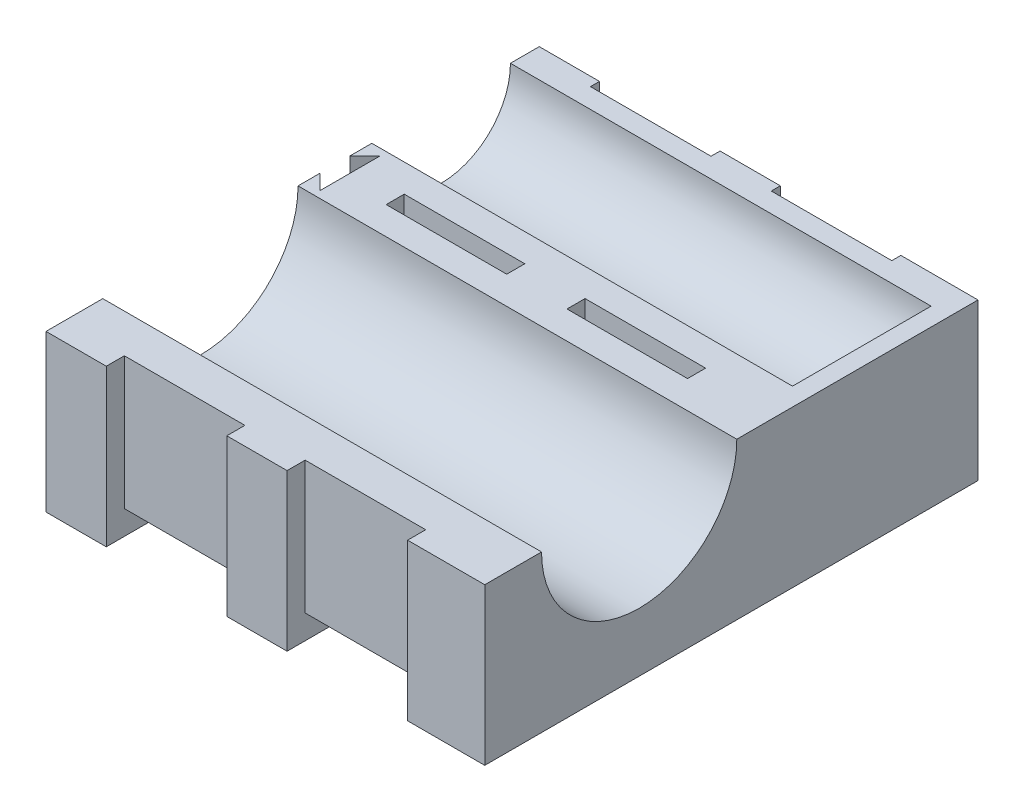
ISO-10303-21;
HEADER;
FILE_DESCRIPTION(('STEP AP214'),'2;1');
FILE_NAME('part.step','',(''),(''),'','','');
FILE_SCHEMA(('AUTOMOTIVE_DESIGN { 1 0 10303 214 1 1 1 1 }'));
ENDSEC;
DATA;
#1=APPLICATION_CONTEXT('core data for automotive mechanical design processes');
#2=APPLICATION_PROTOCOL_DEFINITION('international standard','automotive_design',2000,#1);
#3=PRODUCT_CONTEXT('',#1,'mechanical');
#4=PRODUCT('Part','Part','',(#3));
#5=PRODUCT_RELATED_PRODUCT_CATEGORY('part','',(#4));
#6=PRODUCT_DEFINITION_FORMATION('','',#4);
#7=PRODUCT_DEFINITION_CONTEXT('part definition',#1,'design');
#8=PRODUCT_DEFINITION('design','',#6,#7);
#9=PRODUCT_DEFINITION_SHAPE('','',#8);
#10=(LENGTH_UNIT() NAMED_UNIT(*) SI_UNIT(.MILLI.,.METRE.));
#11=(NAMED_UNIT(*) PLANE_ANGLE_UNIT() SI_UNIT($,.RADIAN.));
#12=(NAMED_UNIT(*) SI_UNIT($,.STERADIAN.) SOLID_ANGLE_UNIT());
#13=UNCERTAINTY_MEASURE_WITH_UNIT(LENGTH_MEASURE(1.E-05),#10,'distance_accuracy_value','');
#14=(GEOMETRIC_REPRESENTATION_CONTEXT(3) GLOBAL_UNCERTAINTY_ASSIGNED_CONTEXT((#13)) GLOBAL_UNIT_ASSIGNED_CONTEXT((#10,
#11,#12)) REPRESENTATION_CONTEXT('',''));
#15=CARTESIAN_POINT('',(0.,0.,0.));
#16=DIRECTION('',(0.,0.,1.));
#17=DIRECTION('',(1.,0.,0.));
#18=AXIS2_PLACEMENT_3D('',#15,#16,#17);
#19=CARTESIAN_POINT('',(0.,0.,0.));
#20=DIRECTION('',(1.,0.,0.));
#21=DIRECTION('',(0.,0.,-1.));
#22=AXIS2_PLACEMENT_3D('',#19,#20,#21);
#23=PLANE('',#22);
#24=DIRECTION('',(0.,0.,-1.));
#25=VECTOR('',#24,1.);
#26=CARTESIAN_POINT('',(0.,25.9607550837009,0.));
#27=LINE('',#26,#25);
#28=CARTESIAN_POINT('',(0.,25.9607550837009,-41.8200258531937));
#29=VERTEX_POINT('',#28);
#30=CARTESIAN_POINT('',(0.,25.9607550837008,-45.4412658573345));
#31=VERTEX_POINT('',#30);
#32=EDGE_CURVE('E11',#29,#31,#27,.T.);
#33=ORIENTED_EDGE('',*,*,#32,.T.);
#34=DIRECTION('',(0.,1.,0.));
#35=VECTOR('',#34,1.);
#36=CARTESIAN_POINT('',(0.,-10.3077640640441,-45.4412658573346));
#37=LINE('',#36,#35);
#38=CARTESIAN_POINT('',(0.,0.,-45.4412658573345));
#39=VERTEX_POINT('',#38);
#40=EDGE_CURVE('E292',#39,#31,#37,.T.);
#41=ORIENTED_EDGE('',*,*,#40,.F.);
#42=DIRECTION('',(0.,0.,-1.));
#43=VECTOR('',#42,1.);
#44=CARTESIAN_POINT('',(0.,0.,0.));
#45=LINE('',#44,#43);
#46=CARTESIAN_POINT('',(0.,0.,0.));
#47=VERTEX_POINT('',#46);
#48=EDGE_CURVE('E571',#47,#39,#45,.T.);
#49=ORIENTED_EDGE('',*,*,#48,.F.);
#50=DIRECTION('',(0.,1.,0.));
#51=VECTOR('',#50,1.);
#52=CARTESIAN_POINT('',(0.,0.,0.));
#53=LINE('',#52,#51);
#54=CARTESIAN_POINT('',(0.,25.9607550837009,0.));
#55=VERTEX_POINT('',#54);
#56=EDGE_CURVE('E566',#47,#55,#53,.T.);
#57=ORIENTED_EDGE('',*,*,#56,.T.);
#58=DIRECTION('',(0.,0.,-1.));
#59=VECTOR('',#58,1.);
#60=CARTESIAN_POINT('',(0.,25.9607550837009,0.));
#61=LINE('',#60,#59);
#62=CARTESIAN_POINT('',(0.,25.9607550837009,-9.4200258531937));
#63=VERTEX_POINT('',#62);
#64=EDGE_CURVE('E562',#55,#63,#61,.T.);
#65=ORIENTED_EDGE('',*,*,#64,.T.);
#66=CARTESIAN_POINT('',(0.,25.9607550837009,-25.6200258531937));
#67=DIRECTION('',(1.,0.,0.));
#68=DIRECTION('',(0.,0.,-1.));
#69=AXIS2_PLACEMENT_3D('',#66,#67,#68);
#70=CIRCLE('',#69,16.2);
#71=EDGE_CURVE('E558',#63,#29,#70,.T.);
#72=ORIENTED_EDGE('',*,*,#71,.T.);
#73=EDGE_LOOP('',(#33,#41,#49,#57,#65,#72));
#74=FACE_BOUND('',#73,.T.);
#75=ADVANCED_FACE('F40',(#74),#23,.F.);
#76=CARTESIAN_POINT('',(0.,4.,0.));
#77=DIRECTION('',(0.,-1.,0.));
#78=DIRECTION('',(0.,0.,-1.));
#79=AXIS2_PLACEMENT_3D('',#76,#77,#78);
#80=PLANE('',#79);
#81=DIRECTION('',(0.,0.,-1.));
#82=VECTOR('',#81,1.);
#83=CARTESIAN_POINT('',(10.,4.,-2.99999999999998));
#84=LINE('',#83,#82);
#85=CARTESIAN_POINT('',(10.,4.00000000000001,-49.4412658573344));
#86=VERTEX_POINT('',#85);
#87=CARTESIAN_POINT('',(10.,4.00000000000001,-80.3401409465381));
#88=VERTEX_POINT('',#87);
#89=EDGE_CURVE('E338',#86,#88,#84,.T.);
#90=ORIENTED_EDGE('',*,*,#89,.T.);
#91=DIRECTION('',(1.,0.,0.));
#92=VECTOR('',#91,1.);
#93=CARTESIAN_POINT('',(10.,4.00000000000001,-80.3401409465381));
#94=LINE('',#93,#92);
#95=CARTESIAN_POINT('',(30.,4.00000000000001,-80.3401409465381));
#96=VERTEX_POINT('',#95);
#97=EDGE_CURVE('E337',#88,#96,#94,.T.);
#98=ORIENTED_EDGE('',*,*,#97,.T.);
#99=DIRECTION('',(0.,0.,1.));
#100=VECTOR('',#99,1.);
#101=CARTESIAN_POINT('',(30.,4.,-2.99999999999996));
#102=LINE('',#101,#100);
#103=CARTESIAN_POINT('',(30.,4.00000000000001,-49.4412658573344));
#104=VERTEX_POINT('',#103);
#105=EDGE_CURVE('E342',#96,#104,#102,.T.);
#106=ORIENTED_EDGE('',*,*,#105,.T.);
#107=DIRECTION('',(1.,0.,0.));
#108=VECTOR('',#107,1.);
#109=CARTESIAN_POINT('',(10.,4.00000000000001,-49.4412658573344));
#110=LINE('',#109,#108);
#111=EDGE_CURVE('E374',#86,#104,#110,.T.);
#112=ORIENTED_EDGE('',*,*,#111,.F.);
#113=EDGE_LOOP('',(#90,#98,#106,#112));
#114=FACE_BOUND('',#113,.T.);
#115=ADVANCED_FACE('F642',(#114),#80,.T.);
#116=DIRECTION('',(1.,0.,0.));
#117=VECTOR('',#116,1.);
#118=CARTESIAN_POINT('',(10.,4.00000000000001,-46.4412658573344));
#119=LINE('',#118,#117);
#120=CARTESIAN_POINT('',(10.,4.00000000000001,-46.4412658573345));
#121=VERTEX_POINT('',#120);
#122=CARTESIAN_POINT('',(30.,4.00000000000001,-46.4412658573345));
#123=VERTEX_POINT('',#122);
#124=EDGE_CURVE('E371',#121,#123,#119,.T.);
#125=ORIENTED_EDGE('',*,*,#124,.T.);
#126=CARTESIAN_POINT('',(30.,4.,-2.99999999999996));
#127=VERTEX_POINT('',#126);
#128=EDGE_CURVE('E341',#123,#127,#102,.T.);
#129=ORIENTED_EDGE('',*,*,#128,.T.);
#130=DIRECTION('',(-1.,0.,0.));
#131=VECTOR('',#130,1.);
#132=CARTESIAN_POINT('',(10.,4.,-2.99999999999998));
#133=LINE('',#132,#131);
#134=CARTESIAN_POINT('',(10.,4.,-2.99999999999998));
#135=VERTEX_POINT('',#134);
#136=EDGE_CURVE('E345',#127,#135,#133,.T.);
#137=ORIENTED_EDGE('',*,*,#136,.T.);
#138=EDGE_CURVE('E334',#135,#121,#84,.T.);
#139=ORIENTED_EDGE('',*,*,#138,.T.);
#140=EDGE_LOOP('',(#125,#129,#137,#139));
#141=FACE_BOUND('',#140,.T.);
#142=ADVANCED_FACE('F649',(#141),#80,.T.);
#143=CARTESIAN_POINT('',(117.3,0.,0.));
#144=DIRECTION('',(0.,1.,0.));
#145=DIRECTION('',(0.,0.,1.));
#146=AXIS2_PLACEMENT_3D('',#143,#144,#145);
#147=PLANE('',#146);
#148=DIRECTION('',(-1.,0.,0.));
#149=VECTOR('',#148,1.);
#150=CARTESIAN_POINT('',(117.3,0.,0.));
#151=LINE('',#150,#149);
#152=CARTESIAN_POINT('',(40.,0.,0.));
#153=VERTEX_POINT('',#152);
#154=CARTESIAN_POINT('',(30.,0.,0.));
#155=VERTEX_POINT('',#154);
#156=EDGE_CURVE('E601',#153,#155,#151,.T.);
#157=ORIENTED_EDGE('',*,*,#156,.T.);
#158=DIRECTION('',(0.,0.,1.));
#159=VECTOR('',#158,1.);
#160=CARTESIAN_POINT('',(30.,0.,-80.3401409465381));
#161=LINE('',#160,#159);
#162=CARTESIAN_POINT('',(30.,0.,-81.8401409465381));
#163=VERTEX_POINT('',#162);
#164=EDGE_CURVE('E403',#163,#155,#161,.T.);
#165=ORIENTED_EDGE('',*,*,#164,.F.);
#166=DIRECTION('',(-1.,0.,0.));
#167=VECTOR('',#166,1.);
#168=CARTESIAN_POINT('',(117.3,0.,-81.8401409465382));
#169=LINE('',#168,#167);
#170=CARTESIAN_POINT('',(40.,0.,-81.8401409465381));
#171=VERTEX_POINT('',#170);
#172=EDGE_CURVE('E596',#171,#163,#169,.T.);
#173=ORIENTED_EDGE('',*,*,#172,.F.);
#174=DIRECTION('',(0.,0.,1.));
#175=VECTOR('',#174,1.);
#176=CARTESIAN_POINT('',(40.,0.,0.));
#177=LINE('',#176,#175);
#178=EDGE_CURVE('E432',#171,#153,#177,.T.);
#179=ORIENTED_EDGE('',*,*,#178,.T.);
#180=EDGE_LOOP('',(#157,#165,#173,#179));
#181=FACE_BOUND('',#180,.T.);
#182=ADVANCED_FACE('F704',(#181),#147,.F.);
#183=CARTESIAN_POINT('',(0.,4.,0.));
#184=DIRECTION('',(0.,-1.,0.));
#185=DIRECTION('',(0.,0.,-1.));
#186=AXIS2_PLACEMENT_3D('',#183,#184,#185);
#187=PLANE('',#186);
#188=DIRECTION('',(0.,0.,-1.));
#189=VECTOR('',#188,1.);
#190=CARTESIAN_POINT('',(40.,4.,-2.99999999999998));
#191=LINE('',#190,#189);
#192=CARTESIAN_POINT('',(40.,4.00000000000001,-49.4412658573349));
#193=VERTEX_POINT('',#192);
#194=CARTESIAN_POINT('',(40.,4.00000000000001,-80.3401409465381));
#195=VERTEX_POINT('',#194);
#196=EDGE_CURVE('E333',#193,#195,#191,.T.);
#197=ORIENTED_EDGE('',*,*,#196,.T.);
#198=DIRECTION('',(1.,0.,0.));
#199=VECTOR('',#198,1.);
#200=CARTESIAN_POINT('',(40.,4.00000000000001,-80.3401409465381));
#201=LINE('',#200,#199);
#202=CARTESIAN_POINT('',(60.,4.00000000000001,-80.3401409465381));
#203=VERTEX_POINT('',#202);
#204=EDGE_CURVE('E353',#195,#203,#201,.T.);
#205=ORIENTED_EDGE('',*,*,#204,.T.);
#206=DIRECTION('',(0.,0.,1.));
#207=VECTOR('',#206,1.);
#208=CARTESIAN_POINT('',(60.,4.,-2.99999999999996));
#209=LINE('',#208,#207);
#210=CARTESIAN_POINT('',(60.,4.00000000000001,-49.4412658573349));
#211=VERTEX_POINT('',#210);
#212=EDGE_CURVE('E358',#203,#211,#209,.T.);
#213=ORIENTED_EDGE('',*,*,#212,.T.);
#214=DIRECTION('',(1.,0.,0.));
#215=VECTOR('',#214,1.);
#216=CARTESIAN_POINT('',(40.,4.00000000000001,-49.4412658573348));
#217=LINE('',#216,#215);
#218=EDGE_CURVE('E367',#193,#211,#217,.T.);
#219=ORIENTED_EDGE('',*,*,#218,.F.);
#220=EDGE_LOOP('',(#197,#205,#213,#219));
#221=FACE_BOUND('',#220,.T.);
#222=ADVANCED_FACE('F700',(#221),#187,.T.);
#223=DIRECTION('',(1.,0.,0.));
#224=VECTOR('',#223,1.);
#225=CARTESIAN_POINT('',(40.,4.00000000000001,-46.4412658573348));
#226=LINE('',#225,#224);
#227=CARTESIAN_POINT('',(40.,4.00000000000001,-46.4412658573349));
#228=VERTEX_POINT('',#227);
#229=CARTESIAN_POINT('',(60.,4.00000000000001,-46.4412658573349));
#230=VERTEX_POINT('',#229);
#231=EDGE_CURVE('E349',#228,#230,#226,.T.);
#232=ORIENTED_EDGE('',*,*,#231,.T.);
#233=CARTESIAN_POINT('',(60.,4.,-2.99999999999996));
#234=VERTEX_POINT('',#233);
#235=EDGE_CURVE('E357',#230,#234,#209,.T.);
#236=ORIENTED_EDGE('',*,*,#235,.T.);
#237=DIRECTION('',(-1.,0.,0.));
#238=VECTOR('',#237,1.);
#239=CARTESIAN_POINT('',(40.,4.,-2.99999999999998));
#240=LINE('',#239,#238);
#241=CARTESIAN_POINT('',(40.,4.,-2.99999999999998));
#242=VERTEX_POINT('',#241);
#243=EDGE_CURVE('E361',#234,#242,#240,.T.);
#244=ORIENTED_EDGE('',*,*,#243,.T.);
#245=EDGE_CURVE('E350',#242,#228,#191,.T.);
#246=ORIENTED_EDGE('',*,*,#245,.T.);
#247=EDGE_LOOP('',(#232,#236,#244,#246));
#248=FACE_BOUND('',#247,.T.);
#249=ADVANCED_FACE('F703',(#248),#187,.T.);
#250=CARTESIAN_POINT('',(72.8,0.,-81.8401409465382));
#251=VERTEX_POINT('',#250);
#252=CARTESIAN_POINT('',(60.,0.,-81.8401409465381));
#253=VERTEX_POINT('',#252);
#254=EDGE_CURVE('E592',#251,#253,#169,.T.);
#255=ORIENTED_EDGE('',*,*,#254,.F.);
#256=DIRECTION('',(0.,0.,-1.));
#257=VECTOR('',#256,1.);
#258=CARTESIAN_POINT('',(72.8,0.,8.65324250901719));
#259=LINE('',#258,#257);
#260=CARTESIAN_POINT('',(72.8,0.,0.));
#261=VERTEX_POINT('',#260);
#262=EDGE_CURVE('E330',#261,#251,#259,.T.);
#263=ORIENTED_EDGE('',*,*,#262,.F.);
#264=CARTESIAN_POINT('',(60.,0.,0.));
#265=VERTEX_POINT('',#264);
#266=EDGE_CURVE('E597',#261,#265,#151,.T.);
#267=ORIENTED_EDGE('',*,*,#266,.T.);
#268=DIRECTION('',(0.,0.,-1.));
#269=VECTOR('',#268,1.);
#270=CARTESIAN_POINT('',(60.,0.,-2.99999999999994));
#271=LINE('',#270,#269);
#272=EDGE_CURVE('E408',#265,#253,#271,.T.);
#273=ORIENTED_EDGE('',*,*,#272,.T.);
#274=EDGE_LOOP('',(#255,#263,#267,#273));
#275=FACE_BOUND('',#274,.T.);
#276=ADVANCED_FACE('F806',(#275),#147,.F.);
#277=ORIENTED_EDGE('',*,*,#48,.T.);
#278=DIRECTION('',(-0.707106781186549,0.,-0.707106781186546));
#279=VECTOR('',#278,1.);
#280=CARTESIAN_POINT('',(0.,0.,-45.4412658573345));
#281=LINE('',#280,#279);
#282=CARTESIAN_POINT('',(2.50000000000001,0.,-42.9412658573345));
#283=VERTEX_POINT('',#282);
#284=EDGE_CURVE('E315',#283,#39,#281,.T.);
#285=ORIENTED_EDGE('',*,*,#284,.F.);
#286=DIRECTION('',(0.,0.,1.));
#287=VECTOR('',#286,1.);
#288=CARTESIAN_POINT('',(2.50000000000001,0.,-42.9412658573346));
#289=LINE('',#288,#287);
#290=CARTESIAN_POINT('',(2.5,0.,-52.9412658573345));
#291=VERTEX_POINT('',#290);
#292=EDGE_CURVE('E283',#291,#283,#289,.T.);
#293=ORIENTED_EDGE('',*,*,#292,.F.);
#294=DIRECTION('',(0.707106781186549,0.,-0.707106781186546));
#295=VECTOR('',#294,1.);
#296=CARTESIAN_POINT('',(2.50000000000001,0.,-52.9412658573345));
#297=LINE('',#296,#295);
#298=CARTESIAN_POINT('',(0.,0.,-50.4412658573345));
#299=VERTEX_POINT('',#298);
#300=EDGE_CURVE('E306',#299,#291,#297,.T.);
#301=ORIENTED_EDGE('',*,*,#300,.F.);
#302=CARTESIAN_POINT('',(0.,0.,-81.8401409465382));
#303=VERTEX_POINT('',#302);
#304=EDGE_CURVE('E570',#299,#303,#45,.T.);
#305=ORIENTED_EDGE('',*,*,#304,.T.);
#306=CARTESIAN_POINT('',(10.,0.,-81.8401409465381));
#307=VERTEX_POINT('',#306);
#308=EDGE_CURVE('E590',#307,#303,#169,.T.);
#309=ORIENTED_EDGE('',*,*,#308,.F.);
#310=DIRECTION('',(0.,0.,-1.));
#311=VECTOR('',#310,1.);
#312=CARTESIAN_POINT('',(10.,0.,-81.8401409465381));
#313=LINE('',#312,#311);
#314=CARTESIAN_POINT('',(10.,0.,0.));
#315=VERTEX_POINT('',#314);
#316=EDGE_CURVE('E442',#315,#307,#313,.T.);
#317=ORIENTED_EDGE('',*,*,#316,.F.);
#318=EDGE_CURVE('E595',#315,#47,#151,.T.);
#319=ORIENTED_EDGE('',*,*,#318,.T.);
#320=EDGE_LOOP('',(#277,#285,#293,#301,#305,#309,#317,#319));
#321=FACE_BOUND('',#320,.T.);
#322=ADVANCED_FACE('F791',(#321),#147,.F.);
#323=CARTESIAN_POINT('',(117.3,0.,0.));
#324=DIRECTION('',(0.,0.,1.));
#325=DIRECTION('',(1.,0.,0.));
#326=AXIS2_PLACEMENT_3D('',#323,#324,#325);
#327=PLANE('',#326);
#328=DIRECTION('',(0.,1.,0.));
#329=VECTOR('',#328,1.);
#330=CARTESIAN_POINT('',(72.8,-0.00100000000036876,0.));
#331=LINE('',#330,#329);
#332=CARTESIAN_POINT('',(72.8,25.9607550837007,1.05818132034585E-13));
#333=VERTEX_POINT('',#332);
#334=EDGE_CURVE('E322',#261,#333,#331,.T.);
#335=ORIENTED_EDGE('',*,*,#334,.T.);
#336=DIRECTION('',(-1.,0.,0.));
#337=VECTOR('',#336,1.);
#338=CARTESIAN_POINT('',(117.3,25.9607550837009,0.));
#339=LINE('',#338,#337);
#340=CARTESIAN_POINT('',(60.,25.9607550837009,0.));
#341=VERTEX_POINT('',#340);
#342=EDGE_CURVE('E602',#333,#341,#339,.T.);
#343=ORIENTED_EDGE('',*,*,#342,.T.);
#344=DIRECTION('',(0.,1.,0.));
#345=VECTOR('',#344,1.);
#346=CARTESIAN_POINT('',(60.,-20.2237484161567,0.));
#347=LINE('',#346,#345);
#348=EDGE_CURVE('E411',#265,#341,#347,.T.);
#349=ORIENTED_EDGE('',*,*,#348,.F.);
#350=ORIENTED_EDGE('',*,*,#266,.F.);
#351=EDGE_LOOP('',(#335,#343,#349,#350));
#352=FACE_BOUND('',#351,.T.);
#353=ADVANCED_FACE('F720',(#352),#327,.T.);
#354=CARTESIAN_POINT('',(40.,-20.2237484161567,-2.99999999999994));
#355=DIRECTION('',(0.,0.,1.));
#356=DIRECTION('',(0.,-1.,0.));
#357=AXIS2_PLACEMENT_3D('',#354,#355,#356);
#358=PLANE('',#357);
#359=DIRECTION('',(0.,1.,0.));
#360=VECTOR('',#359,1.);
#361=CARTESIAN_POINT('',(40.,-20.2237484161567,-2.99999999999994));
#362=LINE('',#361,#360);
#363=CARTESIAN_POINT('',(40.,25.9607550837009,-2.99999999999998));
#364=VERTEX_POINT('',#363);
#365=EDGE_CURVE('E404',#242,#364,#362,.T.);
#366=ORIENTED_EDGE('',*,*,#365,.F.);
#367=ORIENTED_EDGE('',*,*,#243,.F.);
#368=DIRECTION('',(0.,1.,0.));
#369=VECTOR('',#368,1.);
#370=CARTESIAN_POINT('',(60.,-20.2237484161567,-2.99999999999994));
#371=LINE('',#370,#369);
#372=CARTESIAN_POINT('',(60.,25.9607550837009,-2.99999999999998));
#373=VERTEX_POINT('',#372);
#374=EDGE_CURVE('E407',#234,#373,#371,.T.);
#375=ORIENTED_EDGE('',*,*,#374,.T.);
#376=DIRECTION('',(1.,0.,0.));
#377=VECTOR('',#376,1.);
#378=CARTESIAN_POINT('',(40.,25.9607550837009,-2.99999999999998));
#379=LINE('',#378,#377);
#380=EDGE_CURVE('E423',#364,#373,#379,.T.);
#381=ORIENTED_EDGE('',*,*,#380,.F.);
#382=EDGE_LOOP('',(#366,#367,#375,#381));
#383=FACE_BOUND('',#382,.T.);
#384=ADVANCED_FACE('F716',(#383),#358,.T.);
#385=ORIENTED_EDGE('',*,*,#156,.F.);
#386=DIRECTION('',(0.,1.,0.));
#387=VECTOR('',#386,1.);
#388=CARTESIAN_POINT('',(40.,-20.2237484161567,0.));
#389=LINE('',#388,#387);
#390=CARTESIAN_POINT('',(40.,25.9607550837009,0.));
#391=VERTEX_POINT('',#390);
#392=EDGE_CURVE('E415',#153,#391,#389,.T.);
#393=ORIENTED_EDGE('',*,*,#392,.T.);
#394=CARTESIAN_POINT('',(30.,25.9607550837009,0.));
#395=VERTEX_POINT('',#394);
#396=EDGE_CURVE('E606',#391,#395,#339,.T.);
#397=ORIENTED_EDGE('',*,*,#396,.T.);
#398=DIRECTION('',(0.,1.,0.));
#399=VECTOR('',#398,1.);
#400=CARTESIAN_POINT('',(30.,-20.2237484161567,0.));
#401=LINE('',#400,#399);
#402=EDGE_CURVE('E503',#155,#395,#401,.T.);
#403=ORIENTED_EDGE('',*,*,#402,.F.);
#404=EDGE_LOOP('',(#385,#393,#397,#403));
#405=FACE_BOUND('',#404,.T.);
#406=ADVANCED_FACE('F719',(#405),#327,.T.);
#407=CARTESIAN_POINT('',(10.,-20.2237484161567,-2.99999999999994));
#408=DIRECTION('',(0.,0.,1.));
#409=DIRECTION('',(0.,-1.,0.));
#410=AXIS2_PLACEMENT_3D('',#407,#408,#409);
#411=PLANE('',#410);
#412=DIRECTION('',(0.,1.,0.));
#413=VECTOR('',#412,1.);
#414=CARTESIAN_POINT('',(10.,-20.2237484161567,-2.99999999999994));
#415=LINE('',#414,#413);
#416=CARTESIAN_POINT('',(10.,25.9607550837009,-2.99999999999998));
#417=VERTEX_POINT('',#416);
#418=EDGE_CURVE('E431',#135,#417,#415,.T.);
#419=ORIENTED_EDGE('',*,*,#418,.F.);
#420=ORIENTED_EDGE('',*,*,#136,.F.);
#421=DIRECTION('',(0.,1.,0.));
#422=VECTOR('',#421,1.);
#423=CARTESIAN_POINT('',(30.,-20.2237484161567,-2.99999999999994));
#424=LINE('',#423,#422);
#425=CARTESIAN_POINT('',(30.,25.9607550837009,-2.99999999999998));
#426=VERTEX_POINT('',#425);
#427=EDGE_CURVE('E500',#127,#426,#424,.T.);
#428=ORIENTED_EDGE('',*,*,#427,.T.);
#429=DIRECTION('',(1.,0.,0.));
#430=VECTOR('',#429,1.);
#431=CARTESIAN_POINT('',(10.,25.9607550837009,-2.99999999999998));
#432=LINE('',#431,#430);
#433=EDGE_CURVE('E514',#417,#426,#432,.T.);
#434=ORIENTED_EDGE('',*,*,#433,.F.);
#435=EDGE_LOOP('',(#419,#420,#428,#434));
#436=FACE_BOUND('',#435,.T.);
#437=ADVANCED_FACE('F748',(#436),#411,.T.);
#438=ORIENTED_EDGE('',*,*,#318,.F.);
#439=DIRECTION('',(0.,1.,0.));
#440=VECTOR('',#439,1.);
#441=CARTESIAN_POINT('',(10.,-20.2237484161567,0.));
#442=LINE('',#441,#440);
#443=CARTESIAN_POINT('',(10.,25.9607550837009,0.));
#444=VERTEX_POINT('',#443);
#445=EDGE_CURVE('E506',#315,#444,#442,.T.);
#446=ORIENTED_EDGE('',*,*,#445,.T.);
#447=EDGE_CURVE('E600',#444,#55,#339,.T.);
#448=ORIENTED_EDGE('',*,*,#447,.T.);
#449=ORIENTED_EDGE('',*,*,#56,.F.);
#450=EDGE_LOOP('',(#438,#446,#448,#449));
#451=FACE_BOUND('',#450,.T.);
#452=ADVANCED_FACE('F751',(#451),#327,.T.);
#453=CARTESIAN_POINT('',(117.3,25.9607550837009,0.));
#454=DIRECTION('',(0.,1.,0.));
#455=DIRECTION('',(0.,0.,1.));
#456=AXIS2_PLACEMENT_3D('',#453,#454,#455);
#457=PLANE('',#456);
#458=DIRECTION('',(0.,0.,1.));
#459=VECTOR('',#458,1.);
#460=CARTESIAN_POINT('',(72.8,25.9607550837007,8.65324250901729));
#461=LINE('',#460,#459);
#462=CARTESIAN_POINT('',(72.8,25.9607550837007,-9.4200258531937));
#463=VERTEX_POINT('',#462);
#464=EDGE_CURVE('E326',#463,#333,#461,.T.);
#465=ORIENTED_EDGE('',*,*,#464,.F.);
#466=DIRECTION('',(-1.,0.,0.));
#467=VECTOR('',#466,1.);
#468=CARTESIAN_POINT('',(117.3,25.9607550837009,-9.4200258531937));
#469=LINE('',#468,#467);
#470=EDGE_CURVE('E605',#463,#63,#469,.T.);
#471=ORIENTED_EDGE('',*,*,#470,.T.);
#472=ORIENTED_EDGE('',*,*,#64,.F.);
#473=ORIENTED_EDGE('',*,*,#447,.F.);
#474=DIRECTION('',(0.,0.,-1.));
#475=VECTOR('',#474,1.);
#476=CARTESIAN_POINT('',(10.,25.9607550837009,0.));
#477=LINE('',#476,#475);
#478=EDGE_CURVE('E481',#444,#417,#477,.T.);
#479=ORIENTED_EDGE('',*,*,#478,.T.);
#480=ORIENTED_EDGE('',*,*,#433,.T.);
#481=DIRECTION('',(0.,0.,1.));
#482=VECTOR('',#481,1.);
#483=CARTESIAN_POINT('',(30.,25.9607550837009,-2.99999999999998));
#484=LINE('',#483,#482);
#485=EDGE_CURVE('E510',#426,#395,#484,.T.);
#486=ORIENTED_EDGE('',*,*,#485,.T.);
#487=ORIENTED_EDGE('',*,*,#396,.F.);
#488=DIRECTION('',(0.,0.,-1.));
#489=VECTOR('',#488,1.);
#490=CARTESIAN_POINT('',(40.,25.9607550837009,0.));
#491=LINE('',#490,#489);
#492=EDGE_CURVE('E427',#391,#364,#491,.T.);
#493=ORIENTED_EDGE('',*,*,#492,.T.);
#494=ORIENTED_EDGE('',*,*,#380,.T.);
#495=DIRECTION('',(0.,0.,1.));
#496=VECTOR('',#495,1.);
#497=CARTESIAN_POINT('',(60.,25.9607550837009,-2.99999999999998));
#498=LINE('',#497,#496);
#499=EDGE_CURVE('E419',#373,#341,#498,.T.);
#500=ORIENTED_EDGE('',*,*,#499,.T.);
#501=ORIENTED_EDGE('',*,*,#342,.F.);
#502=EDGE_LOOP('',(#465,#471,#472,#473,#479,#480,#486,#487,#493,#494,#500,#501));
#503=FACE_BOUND('',#502,.T.);
#504=ADVANCED_FACE('F757',(#503),#457,.T.);
#505=CARTESIAN_POINT('',(10.,-20.2237484161567,-46.4412658573344));
#506=DIRECTION('',(0.,0.,1.));
#507=DIRECTION('',(1.,0.,0.));
#508=AXIS2_PLACEMENT_3D('',#505,#506,#507);
#509=PLANE('',#508);
#510=ORIENTED_EDGE('',*,*,#124,.F.);
#511=DIRECTION('',(0.,1.,0.));
#512=VECTOR('',#511,1.);
#513=CARTESIAN_POINT('',(10.,-20.2237484161567,-46.4412658573344));
#514=LINE('',#513,#512);
#515=CARTESIAN_POINT('',(10.,25.9607550837008,-46.4412658573345));
#516=VERTEX_POINT('',#515);
#517=EDGE_CURVE('E537',#121,#516,#514,.T.);
#518=ORIENTED_EDGE('',*,*,#517,.T.);
#519=DIRECTION('',(1.,0.,0.));
#520=VECTOR('',#519,1.);
#521=CARTESIAN_POINT('',(10.,25.9607550837008,-46.4412658573345));
#522=LINE('',#521,#520);
#523=CARTESIAN_POINT('',(30.,25.9607550837008,-46.4412658573345));
#524=VERTEX_POINT('',#523);
#525=EDGE_CURVE('E497',#516,#524,#522,.T.);
#526=ORIENTED_EDGE('',*,*,#525,.T.);
#527=DIRECTION('',(0.,1.,0.));
#528=VECTOR('',#527,1.);
#529=CARTESIAN_POINT('',(30.,-20.2237484161567,-46.4412658573344));
#530=LINE('',#529,#528);
#531=EDGE_CURVE('E536',#123,#524,#530,.T.);
#532=ORIENTED_EDGE('',*,*,#531,.F.);
#533=EDGE_LOOP('',(#510,#518,#526,#532));
#534=FACE_BOUND('',#533,.T.);
#535=ADVANCED_FACE('F754',(#534),#509,.F.);
#536=CARTESIAN_POINT('',(10.,-20.2237484161567,-49.4412658573344));
#537=DIRECTION('',(0.,0.,1.));
#538=DIRECTION('',(1.,0.,0.));
#539=AXIS2_PLACEMENT_3D('',#536,#537,#538);
#540=PLANE('',#539);
#541=DIRECTION('',(0.,1.,0.));
#542=VECTOR('',#541,1.);
#543=CARTESIAN_POINT('',(10.,-20.2237484161567,-49.4412658573344));
#544=LINE('',#543,#542);
#545=CARTESIAN_POINT('',(10.,25.9607550837008,-49.4412658573344));
#546=VERTEX_POINT('',#545);
#547=EDGE_CURVE('E541',#86,#546,#544,.T.);
#548=ORIENTED_EDGE('',*,*,#547,.F.);
#549=ORIENTED_EDGE('',*,*,#111,.T.);
#550=DIRECTION('',(0.,1.,0.));
#551=VECTOR('',#550,1.);
#552=CARTESIAN_POINT('',(30.,-20.2237484161567,-49.4412658573344));
#553=LINE('',#552,#551);
#554=CARTESIAN_POINT('',(30.,25.9607550837008,-49.4412658573345));
#555=VERTEX_POINT('',#554);
#556=EDGE_CURVE('E544',#104,#555,#553,.T.);
#557=ORIENTED_EDGE('',*,*,#556,.T.);
#558=DIRECTION('',(1.,0.,0.));
#559=VECTOR('',#558,1.);
#560=CARTESIAN_POINT('',(10.,25.9607550837008,-49.4412658573344));
#561=LINE('',#560,#559);
#562=EDGE_CURVE('E528',#546,#555,#561,.T.);
#563=ORIENTED_EDGE('',*,*,#562,.F.);
#564=EDGE_LOOP('',(#548,#549,#557,#563));
#565=FACE_BOUND('',#564,.T.);
#566=ADVANCED_FACE('F742',(#565),#540,.T.);
#567=CARTESIAN_POINT('',(40.,-20.2237484161567,-46.4412658573348));
#568=DIRECTION('',(0.,0.,1.));
#569=DIRECTION('',(1.,0.,0.));
#570=AXIS2_PLACEMENT_3D('',#567,#568,#569);
#571=PLANE('',#570);
#572=ORIENTED_EDGE('',*,*,#231,.F.);
#573=DIRECTION('',(0.,1.,0.));
#574=VECTOR('',#573,1.);
#575=CARTESIAN_POINT('',(40.,-20.2237484161567,-46.4412658573348));
#576=LINE('',#575,#574);
#577=CARTESIAN_POINT('',(40.,25.9607550837008,-46.4412658573349));
#578=VERTEX_POINT('',#577);
#579=EDGE_CURVE('E468',#228,#578,#576,.T.);
#580=ORIENTED_EDGE('',*,*,#579,.T.);
#581=DIRECTION('',(1.,0.,0.));
#582=VECTOR('',#581,1.);
#583=CARTESIAN_POINT('',(40.,25.9607550837008,-46.4412658573349));
#584=LINE('',#583,#582);
#585=CARTESIAN_POINT('',(60.,25.9607550837008,-46.4412658573349));
#586=VERTEX_POINT('',#585);
#587=EDGE_CURVE('E489',#578,#586,#584,.T.);
#588=ORIENTED_EDGE('',*,*,#587,.T.);
#589=DIRECTION('',(0.,1.,0.));
#590=VECTOR('',#589,1.);
#591=CARTESIAN_POINT('',(60.,-20.2237484161567,-46.4412658573349));
#592=LINE('',#591,#590);
#593=EDGE_CURVE('E472',#230,#586,#592,.T.);
#594=ORIENTED_EDGE('',*,*,#593,.F.);
#595=EDGE_LOOP('',(#572,#580,#588,#594));
#596=FACE_BOUND('',#595,.T.);
#597=ADVANCED_FACE('F738',(#596),#571,.F.);
#598=CARTESIAN_POINT('',(40.,-20.2237484161567,-49.4412658573348));
#599=DIRECTION('',(0.,0.,1.));
#600=DIRECTION('',(1.,0.,0.));
#601=AXIS2_PLACEMENT_3D('',#598,#599,#600);
#602=PLANE('',#601);
#603=DIRECTION('',(0.,1.,0.));
#604=VECTOR('',#603,1.);
#605=CARTESIAN_POINT('',(40.,-20.2237484161567,-49.4412658573348));
#606=LINE('',#605,#604);
#607=CARTESIAN_POINT('',(40.,25.9607550837008,-49.4412658573349));
#608=VERTEX_POINT('',#607);
#609=EDGE_CURVE('E478',#193,#608,#606,.T.);
#610=ORIENTED_EDGE('',*,*,#609,.F.);
#611=ORIENTED_EDGE('',*,*,#218,.T.);
#612=DIRECTION('',(0.,1.,0.));
#613=VECTOR('',#612,1.);
#614=CARTESIAN_POINT('',(60.,-20.2237484161567,-49.4412658573349));
#615=LINE('',#614,#613);
#616=CARTESIAN_POINT('',(60.,25.9607550837008,-49.4412658573349));
#617=VERTEX_POINT('',#616);
#618=EDGE_CURVE('E475',#211,#617,#615,.T.);
#619=ORIENTED_EDGE('',*,*,#618,.T.);
#620=DIRECTION('',(1.,0.,0.));
#621=VECTOR('',#620,1.);
#622=CARTESIAN_POINT('',(40.,25.9607550837008,-49.4412658573349));
#623=LINE('',#622,#621);
#624=EDGE_CURVE('E471',#608,#617,#623,.T.);
#625=ORIENTED_EDGE('',*,*,#624,.F.);
#626=EDGE_LOOP('',(#610,#611,#619,#625));
#627=FACE_BOUND('',#626,.T.);
#628=ADVANCED_FACE('F741',(#627),#602,.T.);
#629=CARTESIAN_POINT('',(117.3,25.9607550837009,-25.6200258531937));
#630=DIRECTION('',(-1.,0.,0.));
#631=DIRECTION('',(0.,0.,1.));
#632=AXIS2_PLACEMENT_3D('',#629,#630,#631);
#633=CYLINDRICAL_SURFACE('',#632,16.2);
#634=CARTESIAN_POINT('',(72.8,25.9607550837009,-25.6200258531937));
#635=DIRECTION('',(-1.,0.,0.));
#636=DIRECTION('',(0.,0.,1.));
#637=AXIS2_PLACEMENT_3D('',#634,#635,#636);
#638=CIRCLE('',#637,16.2);
#639=CARTESIAN_POINT('',(72.8,25.9607550837009,-41.8200258531937));
#640=VERTEX_POINT('',#639);
#641=EDGE_CURVE('E314',#463,#640,#638,.F.);
#642=ORIENTED_EDGE('',*,*,#641,.T.);
#643=DIRECTION('',(-1.,0.,0.));
#644=VECTOR('',#643,1.);
#645=CARTESIAN_POINT('',(117.3,25.9607550837009,-41.8200258531937));
#646=LINE('',#645,#644);
#647=EDGE_CURVE('E608',#640,#29,#646,.T.);
#648=ORIENTED_EDGE('',*,*,#647,.T.);
#649=ORIENTED_EDGE('',*,*,#71,.F.);
#650=ORIENTED_EDGE('',*,*,#470,.F.);
#651=EDGE_LOOP('',(#642,#648,#649,#650));
#652=FACE_BOUND('',#651,.T.);
#653=ADVANCED_FACE('F746',(#652),#633,.F.);
#654=CARTESIAN_POINT('',(117.3,0.,-81.8401409465382));
#655=DIRECTION('',(0.,0.,1.));
#656=DIRECTION('',(0.,-1.,0.));
#657=AXIS2_PLACEMENT_3D('',#654,#655,#656);
#658=PLANE('',#657);
#659=DIRECTION('',(-1.,0.,0.));
#660=VECTOR('',#659,1.);
#661=CARTESIAN_POINT('',(117.3,25.9607550837009,-81.8401409465382));
#662=LINE('',#661,#660);
#663=CARTESIAN_POINT('',(10.,25.9607550837008,-81.8401409465381));
#664=VERTEX_POINT('',#663);
#665=CARTESIAN_POINT('',(0.,25.9607550837009,-81.8401409465382));
#666=VERTEX_POINT('',#665);
#667=EDGE_CURVE('E586',#664,#666,#662,.T.);
#668=ORIENTED_EDGE('',*,*,#667,.F.);
#669=DIRECTION('',(0.,1.,0.));
#670=VECTOR('',#669,1.);
#671=CARTESIAN_POINT('',(10.,-20.2237484161568,-81.8401409465381));
#672=LINE('',#671,#670);
#673=EDGE_CURVE('E451',#307,#664,#672,.T.);
#674=ORIENTED_EDGE('',*,*,#673,.F.);
#675=ORIENTED_EDGE('',*,*,#308,.T.);
#676=DIRECTION('',(0.,1.,0.));
#677=VECTOR('',#676,1.);
#678=CARTESIAN_POINT('',(0.,0.,-81.8401409465382));
#679=LINE('',#678,#677);
#680=EDGE_CURVE('E575',#303,#666,#679,.T.);
#681=ORIENTED_EDGE('',*,*,#680,.T.);
#682=EDGE_LOOP('',(#668,#674,#675,#681));
#683=FACE_BOUND('',#682,.T.);
#684=ADVANCED_FACE('F736',(#683),#658,.F.);
#685=CARTESIAN_POINT('',(10.,-20.2237484161568,-81.8401409465381));
#686=DIRECTION('',(-1.,0.,0.));
#687=DIRECTION('',(0.,0.,1.));
#688=AXIS2_PLACEMENT_3D('',#685,#686,#687);
#689=PLANE('',#688);
#690=ORIENTED_EDGE('',*,*,#316,.T.);
#691=ORIENTED_EDGE('',*,*,#673,.T.);
#692=DIRECTION('',(0.,0.,1.));
#693=VECTOR('',#692,1.);
#694=CARTESIAN_POINT('',(10.,25.9607550837008,-81.8401409465381));
#695=LINE('',#694,#693);
#696=CARTESIAN_POINT('',(10.,25.9607550837008,-80.3401409465381));
#697=VERTEX_POINT('',#696);
#698=EDGE_CURVE('E446',#664,#697,#695,.T.);
#699=ORIENTED_EDGE('',*,*,#698,.T.);
#700=DIRECTION('',(0.,1.,0.));
#701=VECTOR('',#700,1.);
#702=CARTESIAN_POINT('',(10.,-20.2237484161568,-80.3401409465381));
#703=LINE('',#702,#701);
#704=EDGE_CURVE('E454',#88,#697,#703,.T.);
#705=ORIENTED_EDGE('',*,*,#704,.F.);
#706=ORIENTED_EDGE('',*,*,#89,.F.);
#707=ORIENTED_EDGE('',*,*,#547,.T.);
#708=DIRECTION('',(0.,0.,1.));
#709=VECTOR('',#708,1.);
#710=CARTESIAN_POINT('',(10.,25.9607550837008,-49.4412658573344));
#711=LINE('',#710,#709);
#712=EDGE_CURVE('E532',#546,#516,#711,.T.);
#713=ORIENTED_EDGE('',*,*,#712,.T.);
#714=ORIENTED_EDGE('',*,*,#517,.F.);
#715=ORIENTED_EDGE('',*,*,#138,.F.);
#716=ORIENTED_EDGE('',*,*,#418,.T.);
#717=ORIENTED_EDGE('',*,*,#478,.F.);
#718=ORIENTED_EDGE('',*,*,#445,.F.);
#719=EDGE_LOOP('',(#690,#691,#699,#705,#706,#707,#713,#714,#715,#716,#717,#718));
#720=FACE_BOUND('',#719,.T.);
#721=ADVANCED_FACE('F729',(#720),#689,.F.);
#722=CARTESIAN_POINT('',(10.,-20.2237484161568,-80.3401409465381));
#723=DIRECTION('',(0.,0.,1.));
#724=DIRECTION('',(0.,-1.,0.));
#725=AXIS2_PLACEMENT_3D('',#722,#723,#724);
#726=PLANE('',#725);
#727=ORIENTED_EDGE('',*,*,#97,.F.);
#728=ORIENTED_EDGE('',*,*,#704,.T.);
#729=DIRECTION('',(1.,0.,0.));
#730=VECTOR('',#729,1.);
#731=CARTESIAN_POINT('',(10.,25.9607550837008,-80.3401409465381));
#732=LINE('',#731,#730);
#733=CARTESIAN_POINT('',(30.,25.9607550837009,-80.3401409465381));
#734=VERTEX_POINT('',#733);
#735=EDGE_CURVE('E436',#697,#734,#732,.T.);
#736=ORIENTED_EDGE('',*,*,#735,.T.);
#737=DIRECTION('',(0.,1.,0.));
#738=VECTOR('',#737,1.);
#739=CARTESIAN_POINT('',(30.,-20.2237484161568,-80.3401409465381));
#740=LINE('',#739,#738);
#741=EDGE_CURVE('E443',#96,#734,#740,.T.);
#742=ORIENTED_EDGE('',*,*,#741,.F.);
#743=EDGE_LOOP('',(#727,#728,#736,#742));
#744=FACE_BOUND('',#743,.T.);
#745=ADVANCED_FACE('F725',(#744),#726,.F.);
#746=CARTESIAN_POINT('',(30.,-20.2237484161568,-80.3401409465381));
#747=DIRECTION('',(1.,0.,0.));
#748=DIRECTION('',(0.,0.,-1.));
#749=AXIS2_PLACEMENT_3D('',#746,#747,#748);
#750=PLANE('',#749);
#751=ORIENTED_EDGE('',*,*,#164,.T.);
#752=ORIENTED_EDGE('',*,*,#402,.T.);
#753=ORIENTED_EDGE('',*,*,#485,.F.);
#754=ORIENTED_EDGE('',*,*,#427,.F.);
#755=ORIENTED_EDGE('',*,*,#128,.F.);
#756=ORIENTED_EDGE('',*,*,#531,.T.);
#757=DIRECTION('',(0.,0.,1.));
#758=VECTOR('',#757,1.);
#759=CARTESIAN_POINT('',(30.,25.9607550837008,-49.4412658573345));
#760=LINE('',#759,#758);
#761=EDGE_CURVE('E524',#555,#524,#760,.T.);
#762=ORIENTED_EDGE('',*,*,#761,.F.);
#763=ORIENTED_EDGE('',*,*,#556,.F.);
#764=ORIENTED_EDGE('',*,*,#105,.F.);
#765=ORIENTED_EDGE('',*,*,#741,.T.);
#766=DIRECTION('',(0.,0.,-1.));
#767=VECTOR('',#766,1.);
#768=CARTESIAN_POINT('',(30.,25.9607550837008,-80.3401409465381));
#769=LINE('',#768,#767);
#770=CARTESIAN_POINT('',(30.,25.9607550837008,-81.8401409465381));
#771=VERTEX_POINT('',#770);
#772=EDGE_CURVE('E460',#734,#771,#769,.T.);
#773=ORIENTED_EDGE('',*,*,#772,.T.);
#774=DIRECTION('',(0.,1.,0.));
#775=VECTOR('',#774,1.);
#776=CARTESIAN_POINT('',(30.,-20.2237484161568,-81.8401409465381));
#777=LINE('',#776,#775);
#778=EDGE_CURVE('E447',#163,#771,#777,.T.);
#779=ORIENTED_EDGE('',*,*,#778,.F.);
#780=EDGE_LOOP('',(#751,#752,#753,#754,#755,#756,#762,#763,#764,#765,#773,#779));
#781=FACE_BOUND('',#780,.T.);
#782=ADVANCED_FACE('F728',(#781),#750,.F.);
#783=ORIENTED_EDGE('',*,*,#172,.T.);
#784=ORIENTED_EDGE('',*,*,#778,.T.);
#785=CARTESIAN_POINT('',(40.,25.9607550837009,-81.8401409465382));
#786=VERTEX_POINT('',#785);
#787=EDGE_CURVE('E591',#786,#771,#662,.T.);
#788=ORIENTED_EDGE('',*,*,#787,.F.);
#789=DIRECTION('',(0.,1.,0.));
#790=VECTOR('',#789,1.);
#791=CARTESIAN_POINT('',(40.,-20.2237484161568,-81.8401409465381));
#792=LINE('',#791,#790);
#793=EDGE_CURVE('E384',#171,#786,#792,.T.);
#794=ORIENTED_EDGE('',*,*,#793,.F.);
#795=EDGE_LOOP('',(#783,#784,#788,#794));
#796=FACE_BOUND('',#795,.T.);
#797=ADVANCED_FACE('F714',(#796),#658,.F.);
#798=CARTESIAN_POINT('',(40.,-20.2237484161567,0.));
#799=DIRECTION('',(1.,0.,0.));
#800=DIRECTION('',(0.,0.,-1.));
#801=AXIS2_PLACEMENT_3D('',#798,#799,#800);
#802=PLANE('',#801);
#803=ORIENTED_EDGE('',*,*,#178,.F.);
#804=ORIENTED_EDGE('',*,*,#793,.T.);
#805=DIRECTION('',(0.,0.,1.));
#806=VECTOR('',#805,1.);
#807=CARTESIAN_POINT('',(40.,25.9607550837008,-81.8401409465381));
#808=LINE('',#807,#806);
#809=CARTESIAN_POINT('',(40.,25.9607550837008,-80.3401409465381));
#810=VERTEX_POINT('',#809);
#811=EDGE_CURVE('E395',#786,#810,#808,.T.);
#812=ORIENTED_EDGE('',*,*,#811,.T.);
#813=DIRECTION('',(0.,1.,0.));
#814=VECTOR('',#813,1.);
#815=CARTESIAN_POINT('',(40.,-20.2237484161568,-80.3401409465381));
#816=LINE('',#815,#814);
#817=EDGE_CURVE('E387',#195,#810,#816,.T.);
#818=ORIENTED_EDGE('',*,*,#817,.F.);
#819=ORIENTED_EDGE('',*,*,#196,.F.);
#820=ORIENTED_EDGE('',*,*,#609,.T.);
#821=DIRECTION('',(0.,0.,1.));
#822=VECTOR('',#821,1.);
#823=CARTESIAN_POINT('',(40.,25.9607550837008,-49.4412658573349));
#824=LINE('',#823,#822);
#825=EDGE_CURVE('E493',#608,#578,#824,.T.);
#826=ORIENTED_EDGE('',*,*,#825,.T.);
#827=ORIENTED_EDGE('',*,*,#579,.F.);
#828=ORIENTED_EDGE('',*,*,#245,.F.);
#829=ORIENTED_EDGE('',*,*,#365,.T.);
#830=ORIENTED_EDGE('',*,*,#492,.F.);
#831=ORIENTED_EDGE('',*,*,#392,.F.);
#832=EDGE_LOOP('',(#803,#804,#812,#818,#819,#820,#826,#827,#828,#829,#830,#831));
#833=FACE_BOUND('',#832,.T.);
#834=ADVANCED_FACE('F710',(#833),#802,.T.);
#835=CARTESIAN_POINT('',(40.,-20.2237484161568,-80.3401409465381));
#836=DIRECTION('',(0.,0.,1.));
#837=DIRECTION('',(0.,-1.,0.));
#838=AXIS2_PLACEMENT_3D('',#835,#836,#837);
#839=PLANE('',#838);
#840=ORIENTED_EDGE('',*,*,#204,.F.);
#841=ORIENTED_EDGE('',*,*,#817,.T.);
#842=DIRECTION('',(1.,0.,0.));
#843=VECTOR('',#842,1.);
#844=CARTESIAN_POINT('',(40.,25.9607550837008,-80.3401409465381));
#845=LINE('',#844,#843);
#846=CARTESIAN_POINT('',(60.,25.9607550837008,-80.3401409465381));
#847=VERTEX_POINT('',#846);
#848=EDGE_CURVE('E383',#810,#847,#845,.T.);
#849=ORIENTED_EDGE('',*,*,#848,.T.);
#850=DIRECTION('',(0.,1.,0.));
#851=VECTOR('',#850,1.);
#852=CARTESIAN_POINT('',(60.,-20.2237484161568,-80.3401409465381));
#853=LINE('',#852,#851);
#854=EDGE_CURVE('E378',#203,#847,#853,.T.);
#855=ORIENTED_EDGE('',*,*,#854,.F.);
#856=EDGE_LOOP('',(#840,#841,#849,#855));
#857=FACE_BOUND('',#856,.T.);
#858=ADVANCED_FACE('F706',(#857),#839,.F.);
#859=CARTESIAN_POINT('',(60.,-20.2237484161567,-2.99999999999994));
#860=DIRECTION('',(-1.,0.,0.));
#861=DIRECTION('',(0.,0.,1.));
#862=AXIS2_PLACEMENT_3D('',#859,#860,#861);
#863=PLANE('',#862);
#864=ORIENTED_EDGE('',*,*,#348,.T.);
#865=ORIENTED_EDGE('',*,*,#499,.F.);
#866=ORIENTED_EDGE('',*,*,#374,.F.);
#867=ORIENTED_EDGE('',*,*,#235,.F.);
#868=ORIENTED_EDGE('',*,*,#593,.T.);
#869=DIRECTION('',(0.,0.,1.));
#870=VECTOR('',#869,1.);
#871=CARTESIAN_POINT('',(60.,25.9607550837008,-49.4412658573349));
#872=LINE('',#871,#870);
#873=EDGE_CURVE('E485',#617,#586,#872,.T.);
#874=ORIENTED_EDGE('',*,*,#873,.F.);
#875=ORIENTED_EDGE('',*,*,#618,.F.);
#876=ORIENTED_EDGE('',*,*,#212,.F.);
#877=ORIENTED_EDGE('',*,*,#854,.T.);
#878=DIRECTION('',(0.,0.,-1.));
#879=VECTOR('',#878,1.);
#880=CARTESIAN_POINT('',(60.,25.9607550837008,-80.3401409465381));
#881=LINE('',#880,#879);
#882=CARTESIAN_POINT('',(60.,25.9607550837008,-81.8401409465381));
#883=VERTEX_POINT('',#882);
#884=EDGE_CURVE('E399',#847,#883,#881,.T.);
#885=ORIENTED_EDGE('',*,*,#884,.T.);
#886=DIRECTION('',(0.,1.,0.));
#887=VECTOR('',#886,1.);
#888=CARTESIAN_POINT('',(60.,-20.2237484161568,-81.8401409465381));
#889=LINE('',#888,#887);
#890=EDGE_CURVE('E379',#253,#883,#889,.T.);
#891=ORIENTED_EDGE('',*,*,#890,.F.);
#892=ORIENTED_EDGE('',*,*,#272,.F.);
#893=EDGE_LOOP('',(#864,#865,#866,#867,#868,#874,#875,#876,#877,#885,#891,#892));
#894=FACE_BOUND('',#893,.T.);
#895=ADVANCED_FACE('F709',(#894),#863,.T.);
#896=CARTESIAN_POINT('',(72.8,25.960755083701,-81.8401409465382));
#897=VERTEX_POINT('',#896);
#898=EDGE_CURVE('E587',#897,#883,#662,.T.);
#899=ORIENTED_EDGE('',*,*,#898,.F.);
#900=DIRECTION('',(0.,1.,0.));
#901=VECTOR('',#900,1.);
#902=CARTESIAN_POINT('',(72.8,-0.00100000000032039,-81.8401409465382));
#903=LINE('',#902,#901);
#904=EDGE_CURVE('E319',#251,#897,#903,.T.);
#905=ORIENTED_EDGE('',*,*,#904,.F.);
#906=ORIENTED_EDGE('',*,*,#254,.T.);
#907=ORIENTED_EDGE('',*,*,#890,.T.);
#908=EDGE_LOOP('',(#899,#905,#906,#907));
#909=FACE_BOUND('',#908,.T.);
#910=ADVANCED_FACE('F636',(#909),#658,.F.);
#911=CARTESIAN_POINT('',(72.8,-0.00100000000036876,8.65324250901719));
#912=DIRECTION('',(-1.,0.,0.));
#913=DIRECTION('',(0.,0.,1.));
#914=AXIS2_PLACEMENT_3D('',#911,#912,#913);
#915=PLANE('',#914);
#916=ORIENTED_EDGE('',*,*,#262,.T.);
#917=ORIENTED_EDGE('',*,*,#904,.T.);
#918=EDGE_CURVE('E329',#897,#640,#461,.T.);
#919=ORIENTED_EDGE('',*,*,#918,.T.);
#920=ORIENTED_EDGE('',*,*,#641,.F.);
#921=ORIENTED_EDGE('',*,*,#464,.T.);
#922=ORIENTED_EDGE('',*,*,#334,.F.);
#923=EDGE_LOOP('',(#916,#917,#919,#920,#921,#922));
#924=FACE_BOUND('',#923,.T.);
#925=ADVANCED_FACE('F628',(#924),#915,.F.);
#926=CARTESIAN_POINT('',(69.8,25.9607550837009,-65.5625058614753));
#927=DIRECTION('',(1.,0.,0.));
#928=DIRECTION('',(0.,0.,-1.));
#929=AXIS2_PLACEMENT_3D('',#926,#927,#928);
#930=PLANE('',#929);
#931=CARTESIAN_POINT('',(69.8,25.9607550837009,-65.5625058614753));
#932=DIRECTION('',(1.,0.,0.));
#933=DIRECTION('',(0.,0.,-1.));
#934=AXIS2_PLACEMENT_3D('',#931,#932,#933);
#935=CIRCLE('',#934,11.5);
#936=CARTESIAN_POINT('',(69.8,25.9607550837009,-54.0625058614753));
#937=VERTEX_POINT('',#936);
#938=CARTESIAN_POINT('',(69.8,25.9607550837009,-77.0625058614753));
#939=VERTEX_POINT('',#938);
#940=EDGE_CURVE('E540',#937,#939,#935,.T.);
#941=ORIENTED_EDGE('',*,*,#940,.F.);
#942=DIRECTION('',(0.,0.,1.));
#943=VECTOR('',#942,1.);
#944=CARTESIAN_POINT('',(69.8,25.9607550837009,-54.0625058614753));
#945=LINE('',#944,#943);
#946=EDGE_CURVE('E551',#939,#937,#945,.T.);
#947=ORIENTED_EDGE('',*,*,#946,.F.);
#948=EDGE_LOOP('',(#941,#947));
#949=FACE_BOUND('',#948,.T.);
#950=ADVANCED_FACE('F626',(#949),#930,.F.);
#951=CARTESIAN_POINT('',(117.3,25.9607550837007,0.));
#952=DIRECTION('',(0.,1.,0.));
#953=DIRECTION('',(0.,0.,1.));
#954=AXIS2_PLACEMENT_3D('',#951,#952,#953);
#955=PLANE('',#954);
#956=DIRECTION('',(0.707106781186549,0.,0.707106781186546));
#957=VECTOR('',#956,1.);
#958=CARTESIAN_POINT('',(0.,25.9607550837008,-45.4412658573345));
#959=LINE('',#958,#957);
#960=CARTESIAN_POINT('',(2.50000000000001,25.9607550837008,-42.9412658573345));
#961=VERTEX_POINT('',#960);
#962=EDGE_CURVE('E289',#31,#961,#959,.T.);
#963=ORIENTED_EDGE('',*,*,#962,.F.);
#964=ORIENTED_EDGE('',*,*,#32,.F.);
#965=ORIENTED_EDGE('',*,*,#647,.F.);
#966=ORIENTED_EDGE('',*,*,#918,.F.);
#967=ORIENTED_EDGE('',*,*,#898,.T.);
#968=ORIENTED_EDGE('',*,*,#884,.F.);
#969=ORIENTED_EDGE('',*,*,#848,.F.);
#970=ORIENTED_EDGE('',*,*,#811,.F.);
#971=ORIENTED_EDGE('',*,*,#787,.T.);
#972=ORIENTED_EDGE('',*,*,#772,.F.);
#973=ORIENTED_EDGE('',*,*,#735,.F.);
#974=ORIENTED_EDGE('',*,*,#698,.F.);
#975=ORIENTED_EDGE('',*,*,#667,.T.);
#976=DIRECTION('',(0.,0.,-1.));
#977=VECTOR('',#976,1.);
#978=CARTESIAN_POINT('',(0.,25.9607550837007,0.));
#979=LINE('',#978,#977);
#980=CARTESIAN_POINT('',(0.,25.9607550837009,-77.0625058614753));
#981=VERTEX_POINT('',#980);
#982=EDGE_CURVE('E579',#981,#666,#979,.T.);
#983=ORIENTED_EDGE('',*,*,#982,.F.);
#984=DIRECTION('',(-1.,0.,0.));
#985=VECTOR('',#984,1.);
#986=CARTESIAN_POINT('',(117.3,25.9607550837009,-77.0625058614753));
#987=LINE('',#986,#985);
#988=EDGE_CURVE('E583',#939,#981,#987,.T.);
#989=ORIENTED_EDGE('',*,*,#988,.F.);
#990=ORIENTED_EDGE('',*,*,#946,.T.);
#991=DIRECTION('',(-1.,0.,0.));
#992=VECTOR('',#991,1.);
#993=CARTESIAN_POINT('',(117.3,25.9607550837009,-54.0625058614753));
#994=LINE('',#993,#992);
#995=CARTESIAN_POINT('',(0.,25.9607550837009,-54.0625058614753));
#996=VERTEX_POINT('',#995);
#997=EDGE_CURVE('E44',#937,#996,#994,.T.);
#998=ORIENTED_EDGE('',*,*,#997,.T.);
#999=CARTESIAN_POINT('',(0.,25.9607550837009,-50.4412658573345));
#1000=VERTEX_POINT('',#999);
#1001=EDGE_CURVE('E50',#1000,#996,#27,.T.);
#1002=ORIENTED_EDGE('',*,*,#1001,.F.);
#1003=DIRECTION('',(-0.707106781186549,0.,0.707106781186546));
#1004=VECTOR('',#1003,1.);
#1005=CARTESIAN_POINT('',(2.5,25.9607550837008,-52.9412658573345));
#1006=LINE('',#1005,#1004);
#1007=CARTESIAN_POINT('',(2.5,25.9607550837008,-52.9412658573345));
#1008=VERTEX_POINT('',#1007);
#1009=EDGE_CURVE('E58',#1008,#1000,#1006,.T.);
#1010=ORIENTED_EDGE('',*,*,#1009,.F.);
#1011=DIRECTION('',(0.,0.,-1.));
#1012=VECTOR('',#1011,1.);
#1013=CARTESIAN_POINT('',(2.50000000000001,25.9607550837008,-42.9412658573345));
#1014=LINE('',#1013,#1012);
#1015=EDGE_CURVE('E281',#961,#1008,#1014,.T.);
#1016=ORIENTED_EDGE('',*,*,#1015,.F.);
#1017=EDGE_LOOP('',(#963,#964,#965,#966,#967,#968,#969,#970,#971,#972,#973,#974,#975,#983,#989,
#990,#998,#1002,#1010,#1016));
#1018=FACE_BOUND('',#1017,.T.);
#1019=ORIENTED_EDGE('',*,*,#825,.F.);
#1020=ORIENTED_EDGE('',*,*,#624,.T.);
#1021=ORIENTED_EDGE('',*,*,#873,.T.);
#1022=ORIENTED_EDGE('',*,*,#587,.F.);
#1023=EDGE_LOOP('',(#1019,#1020,#1021,#1022));
#1024=FACE_BOUND('',#1023,.T.);
#1025=ORIENTED_EDGE('',*,*,#562,.T.);
#1026=ORIENTED_EDGE('',*,*,#761,.T.);
#1027=ORIENTED_EDGE('',*,*,#525,.F.);
#1028=ORIENTED_EDGE('',*,*,#712,.F.);
#1029=EDGE_LOOP('',(#1025,#1026,#1027,#1028));
#1030=FACE_BOUND('',#1029,.T.);
#1031=ADVANCED_FACE('F295',(#1018,#1024,#1030),#955,.T.);
#1032=CARTESIAN_POINT('',(117.3,25.9607550837009,-65.5625058614753));
#1033=DIRECTION('',(-1.,0.,0.));
#1034=DIRECTION('',(0.,0.,1.));
#1035=AXIS2_PLACEMENT_3D('',#1032,#1033,#1034);
#1036=CYLINDRICAL_SURFACE('',#1035,11.5);
#1037=ORIENTED_EDGE('',*,*,#997,.F.);
#1038=ORIENTED_EDGE('',*,*,#940,.T.);
#1039=ORIENTED_EDGE('',*,*,#988,.T.);
#1040=CARTESIAN_POINT('',(0.,25.9607550837009,-65.5625058614753));
#1041=DIRECTION('',(1.,0.,0.));
#1042=DIRECTION('',(0.,0.,-1.));
#1043=AXIS2_PLACEMENT_3D('',#1040,#1041,#1042);
#1044=CIRCLE('',#1043,11.5);
#1045=EDGE_CURVE('E555',#996,#981,#1044,.T.);
#1046=ORIENTED_EDGE('',*,*,#1045,.F.);
#1047=EDGE_LOOP('',(#1037,#1038,#1039,#1046));
#1048=FACE_BOUND('',#1047,.T.);
#1049=ADVANCED_FACE('F42',(#1048),#1036,.F.);
#1050=ORIENTED_EDGE('',*,*,#304,.F.);
#1051=DIRECTION('',(0.,1.,0.));
#1052=VECTOR('',#1051,1.);
#1053=CARTESIAN_POINT('',(0.,-10.3077640640441,-50.4412658573346));
#1054=LINE('',#1053,#1052);
#1055=EDGE_CURVE('E307',#299,#1000,#1054,.T.);
#1056=ORIENTED_EDGE('',*,*,#1055,.T.);
#1057=ORIENTED_EDGE('',*,*,#1001,.T.);
#1058=ORIENTED_EDGE('',*,*,#1045,.T.);
#1059=ORIENTED_EDGE('',*,*,#982,.T.);
#1060=ORIENTED_EDGE('',*,*,#680,.F.);
#1061=EDGE_LOOP('',(#1050,#1056,#1057,#1058,#1059,#1060));
#1062=FACE_BOUND('',#1061,.T.);
#1063=ADVANCED_FACE('F619',(#1062),#23,.F.);
#1064=CARTESIAN_POINT('',(0.,-10.3077640640441,-45.4412658573346));
#1065=DIRECTION('',(-0.707106781186546,0.,0.707106781186549));
#1066=DIRECTION('',(0.707106781186549,0.,0.707106781186546));
#1067=AXIS2_PLACEMENT_3D('',#1064,#1065,#1066);
#1068=PLANE('',#1067);
#1069=ORIENTED_EDGE('',*,*,#284,.T.);
#1070=ORIENTED_EDGE('',*,*,#40,.T.);
#1071=ORIENTED_EDGE('',*,*,#962,.T.);
#1072=DIRECTION('',(0.,1.,0.));
#1073=VECTOR('',#1072,1.);
#1074=CARTESIAN_POINT('',(2.50000000000001,-10.3077640640442,-42.9412658573346));
#1075=LINE('',#1074,#1073);
#1076=EDGE_CURVE('E276',#283,#961,#1075,.T.);
#1077=ORIENTED_EDGE('',*,*,#1076,.F.);
#1078=EDGE_LOOP('',(#1069,#1070,#1071,#1077));
#1079=FACE_BOUND('',#1078,.T.);
#1080=ADVANCED_FACE('F290',(#1079),#1068,.F.);
#1081=CARTESIAN_POINT('',(2.5,-10.3077640640441,-52.9412658573346));
#1082=DIRECTION('',(-0.707106781186546,0.,-0.707106781186549));
#1083=DIRECTION('',(-0.707106781186549,0.,0.707106781186546));
#1084=AXIS2_PLACEMENT_3D('',#1081,#1082,#1083);
#1085=PLANE('',#1084);
#1086=ORIENTED_EDGE('',*,*,#300,.T.);
#1087=DIRECTION('',(0.,1.,0.));
#1088=VECTOR('',#1087,1.);
#1089=CARTESIAN_POINT('',(2.5,-10.3077640640441,-52.9412658573346));
#1090=LINE('',#1089,#1088);
#1091=EDGE_CURVE('E287',#291,#1008,#1090,.T.);
#1092=ORIENTED_EDGE('',*,*,#1091,.T.);
#1093=ORIENTED_EDGE('',*,*,#1009,.T.);
#1094=ORIENTED_EDGE('',*,*,#1055,.F.);
#1095=EDGE_LOOP('',(#1086,#1092,#1093,#1094));
#1096=FACE_BOUND('',#1095,.T.);
#1097=ADVANCED_FACE('F657',(#1096),#1085,.F.);
#1098=CARTESIAN_POINT('',(2.50000000000001,-10.3077640640442,-42.9412658573346));
#1099=DIRECTION('',(1.,0.,0.));
#1100=DIRECTION('',(0.,0.,-1.));
#1101=AXIS2_PLACEMENT_3D('',#1098,#1099,#1100);
#1102=PLANE('',#1101);
#1103=ORIENTED_EDGE('',*,*,#292,.T.);
#1104=ORIENTED_EDGE('',*,*,#1076,.T.);
#1105=ORIENTED_EDGE('',*,*,#1015,.T.);
#1106=ORIENTED_EDGE('',*,*,#1091,.F.);
#1107=EDGE_LOOP('',(#1103,#1104,#1105,#1106));
#1108=FACE_BOUND('',#1107,.T.);
#1109=ADVANCED_FACE('F278',(#1108),#1102,.F.);
#1110=CLOSED_SHELL('',(#75,#115,#142,#182,#222,#249,#276,#322,#353,#384,#406,#437,#452,#504,
#535,#566,#597,#628,#653,#684,#721,#745,#782,#797,#834,#858,#895,#910,#925,#950,#1031,#1049,
#1063,#1080,#1097,#1109));
#1111=MANIFOLD_SOLID_BREP('B2',#1110);
#1112=ADVANCED_BREP_SHAPE_REPRESENTATION('',(#18,#1111),#14);
#1113=SHAPE_DEFINITION_REPRESENTATION(#9,#1112);
ENDSEC;
END-ISO-10303-21;
